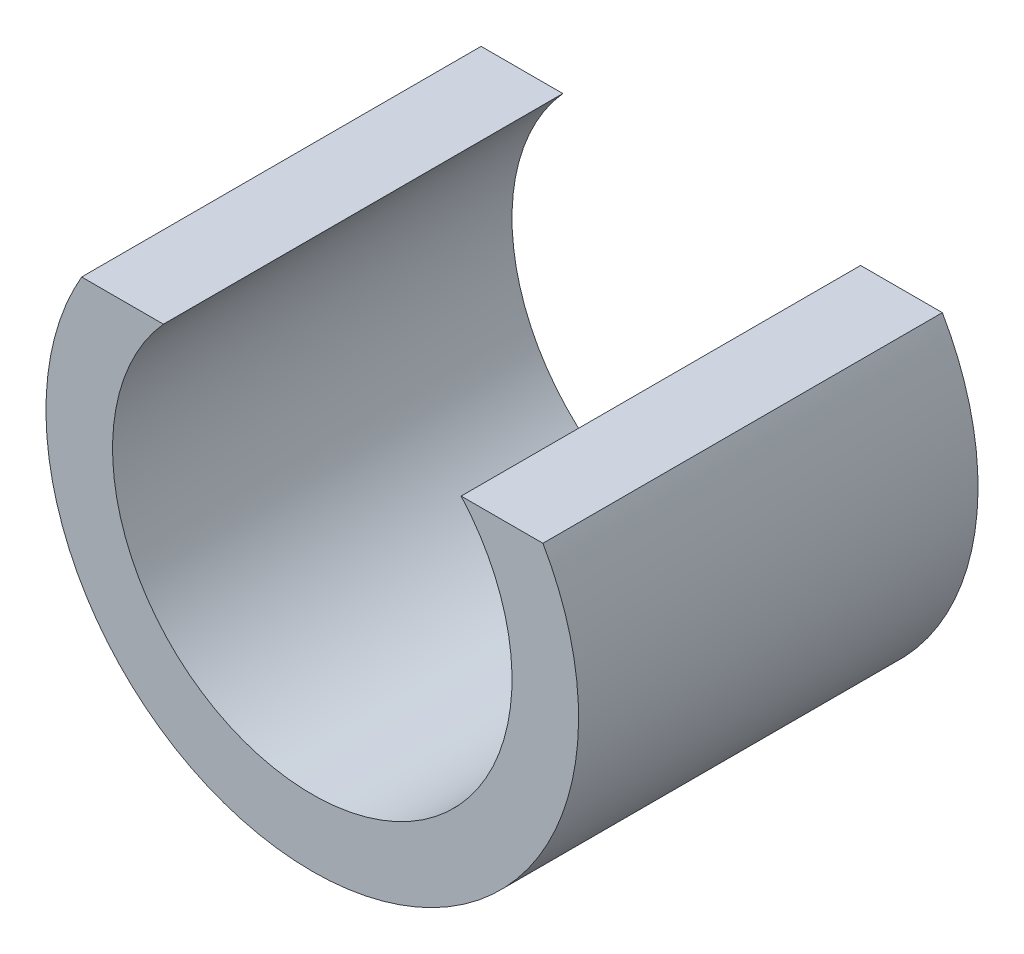
ISO-10303-21;
HEADER;
FILE_DESCRIPTION(('STEP AP214'),'2;1');
FILE_NAME('part.step','',(''),(''),'','','');
FILE_SCHEMA(('AUTOMOTIVE_DESIGN { 1 0 10303 214 1 1 1 1 }'));
ENDSEC;
DATA;
#1=APPLICATION_CONTEXT('core data for automotive mechanical design processes');
#2=APPLICATION_PROTOCOL_DEFINITION('international standard','automotive_design',2000,#1);
#3=PRODUCT_CONTEXT('',#1,'mechanical');
#4=PRODUCT('Part','Part','',(#3));
#5=PRODUCT_RELATED_PRODUCT_CATEGORY('part','',(#4));
#6=PRODUCT_DEFINITION_FORMATION('','',#4);
#7=PRODUCT_DEFINITION_CONTEXT('part definition',#1,'design');
#8=PRODUCT_DEFINITION('design','',#6,#7);
#9=PRODUCT_DEFINITION_SHAPE('','',#8);
#10=(LENGTH_UNIT() NAMED_UNIT(*) SI_UNIT(.MILLI.,.METRE.));
#11=(NAMED_UNIT(*) PLANE_ANGLE_UNIT() SI_UNIT($,.RADIAN.));
#12=(NAMED_UNIT(*) SI_UNIT($,.STERADIAN.) SOLID_ANGLE_UNIT());
#13=UNCERTAINTY_MEASURE_WITH_UNIT(LENGTH_MEASURE(1.E-05),#10,'distance_accuracy_value','');
#14=(GEOMETRIC_REPRESENTATION_CONTEXT(3) GLOBAL_UNCERTAINTY_ASSIGNED_CONTEXT((#13)) GLOBAL_UNIT_ASSIGNED_CONTEXT((#10,
#11,#12)) REPRESENTATION_CONTEXT('',''));
#15=CARTESIAN_POINT('',(0.,0.,0.));
#16=DIRECTION('',(0.,0.,1.));
#17=DIRECTION('',(1.,0.,0.));
#18=AXIS2_PLACEMENT_3D('',#15,#16,#17);
#19=CARTESIAN_POINT('',(0.,0.,3.));
#20=DIRECTION('',(0.,0.,-1.));
#21=DIRECTION('',(-1.,0.,0.));
#22=AXIS2_PLACEMENT_3D('',#19,#20,#21);
#23=CYLINDRICAL_SURFACE('',#22,2.);
#24=CARTESIAN_POINT('',(0.,0.,0.));
#25=DIRECTION('',(0.,0.,1.));
#26=DIRECTION('',(1.,0.,0.));
#27=AXIS2_PLACEMENT_3D('',#24,#25,#26);
#28=CIRCLE('',#27,2.);
#29=CARTESIAN_POINT('',(-1.73205080756888,1.,0.));
#30=VERTEX_POINT('',#29);
#31=CARTESIAN_POINT('',(1.73205080756888,1.,0.));
#32=VERTEX_POINT('',#31);
#33=EDGE_CURVE('E39',#30,#32,#28,.T.);
#34=ORIENTED_EDGE('',*,*,#33,.T.);
#35=DIRECTION('',(0.,0.,-1.));
#36=VECTOR('',#35,1.);
#37=CARTESIAN_POINT('',(1.73205080756888,1.,3.));
#38=LINE('',#37,#36);
#39=CARTESIAN_POINT('',(1.73205080756888,1.,3.));
#40=VERTEX_POINT('',#39);
#41=EDGE_CURVE('E58',#32,#40,#38,.F.);
#42=ORIENTED_EDGE('',*,*,#41,.T.);
#43=CARTESIAN_POINT('',(0.,0.,3.));
#44=DIRECTION('',(0.,0.,1.));
#45=DIRECTION('',(1.,0.,0.));
#46=AXIS2_PLACEMENT_3D('',#43,#44,#45);
#47=CIRCLE('',#46,2.);
#48=CARTESIAN_POINT('',(-1.73205080756888,1.,3.));
#49=VERTEX_POINT('',#48);
#50=EDGE_CURVE('E11',#49,#40,#47,.T.);
#51=ORIENTED_EDGE('',*,*,#50,.F.);
#52=DIRECTION('',(0.,0.,-1.));
#53=VECTOR('',#52,1.);
#54=CARTESIAN_POINT('',(-1.73205080756888,1.,3.));
#55=LINE('',#54,#53);
#56=EDGE_CURVE('E80',#30,#49,#55,.F.);
#57=ORIENTED_EDGE('',*,*,#56,.F.);
#58=EDGE_LOOP('',(#34,#42,#51,#57));
#59=FACE_BOUND('',#58,.T.);
#60=ADVANCED_FACE('F36',(#59),#23,.T.);
#61=CARTESIAN_POINT('',(0.,0.,3.));
#62=DIRECTION('',(0.,0.,1.));
#63=DIRECTION('',(1.,0.,0.));
#64=AXIS2_PLACEMENT_3D('',#61,#62,#63);
#65=PLANE('',#64);
#66=DIRECTION('',(1.,0.,0.));
#67=VECTOR('',#66,1.);
#68=CARTESIAN_POINT('',(0.,1.,3.));
#69=LINE('',#68,#67);
#70=CARTESIAN_POINT('',(1.1180339887499,1.,3.));
#71=VERTEX_POINT('',#70);
#72=EDGE_CURVE('E93',#71,#40,#69,.T.);
#73=ORIENTED_EDGE('',*,*,#72,.F.);
#74=CARTESIAN_POINT('',(0.,0.,3.));
#75=DIRECTION('',(0.,0.,1.));
#76=DIRECTION('',(1.,0.,0.));
#77=AXIS2_PLACEMENT_3D('',#74,#75,#76);
#78=CIRCLE('',#77,1.5);
#79=CARTESIAN_POINT('',(-1.1180339887499,1.,3.));
#80=VERTEX_POINT('',#79);
#81=EDGE_CURVE('E78',#80,#71,#78,.T.);
#82=ORIENTED_EDGE('',*,*,#81,.F.);
#83=DIRECTION('',(-1.,0.,0.));
#84=VECTOR('',#83,1.);
#85=CARTESIAN_POINT('',(0.,1.,3.));
#86=LINE('',#85,#84);
#87=EDGE_CURVE('E96',#80,#49,#86,.T.);
#88=ORIENTED_EDGE('',*,*,#87,.T.);
#89=ORIENTED_EDGE('',*,*,#50,.T.);
#90=EDGE_LOOP('',(#73,#82,#88,#89));
#91=FACE_BOUND('',#90,.T.);
#92=ADVANCED_FACE('F110',(#91),#65,.T.);
#93=CARTESIAN_POINT('',(0.,0.,0.));
#94=DIRECTION('',(0.,0.,1.));
#95=DIRECTION('',(1.,0.,0.));
#96=AXIS2_PLACEMENT_3D('',#93,#94,#95);
#97=PLANE('',#96);
#98=CARTESIAN_POINT('',(0.,0.,0.));
#99=DIRECTION('',(0.,0.,1.));
#100=DIRECTION('',(1.,0.,0.));
#101=AXIS2_PLACEMENT_3D('',#98,#99,#100);
#102=CIRCLE('',#101,1.5);
#103=CARTESIAN_POINT('',(-1.1180339887499,1.,0.));
#104=VERTEX_POINT('',#103);
#105=CARTESIAN_POINT('',(1.1180339887499,1.,0.));
#106=VERTEX_POINT('',#105);
#107=EDGE_CURVE('E50',#104,#106,#102,.T.);
#108=ORIENTED_EDGE('',*,*,#107,.T.);
#109=DIRECTION('',(1.,0.,0.));
#110=VECTOR('',#109,1.);
#111=CARTESIAN_POINT('',(0.,1.,0.));
#112=LINE('',#111,#110);
#113=EDGE_CURVE('E83',#106,#32,#112,.T.);
#114=ORIENTED_EDGE('',*,*,#113,.T.);
#115=ORIENTED_EDGE('',*,*,#33,.F.);
#116=DIRECTION('',(-1.,0.,0.));
#117=VECTOR('',#116,1.);
#118=CARTESIAN_POINT('',(0.,1.,0.));
#119=LINE('',#118,#117);
#120=EDGE_CURVE('E91',#104,#30,#119,.T.);
#121=ORIENTED_EDGE('',*,*,#120,.F.);
#122=EDGE_LOOP('',(#108,#114,#115,#121));
#123=FACE_BOUND('',#122,.T.);
#124=ADVANCED_FACE('F90',(#123),#97,.F.);
#125=CARTESIAN_POINT('',(0.,1.,0.));
#126=DIRECTION('',(0.,-1.,0.));
#127=DIRECTION('',(0.,0.,-1.));
#128=AXIS2_PLACEMENT_3D('',#125,#126,#127);
#129=PLANE('',#128);
#130=ORIENTED_EDGE('',*,*,#113,.F.);
#131=DIRECTION('',(0.,0.,1.));
#132=VECTOR('',#131,1.);
#133=CARTESIAN_POINT('',(1.1180339887499,1.,0.));
#134=LINE('',#133,#132);
#135=EDGE_CURVE('E75',#106,#71,#134,.T.);
#136=ORIENTED_EDGE('',*,*,#135,.T.);
#137=ORIENTED_EDGE('',*,*,#72,.T.);
#138=ORIENTED_EDGE('',*,*,#41,.F.);
#139=EDGE_LOOP('',(#130,#136,#137,#138));
#140=FACE_BOUND('',#139,.T.);
#141=ADVANCED_FACE('F84',(#140),#129,.F.);
#142=CARTESIAN_POINT('',(0.,1.,0.));
#143=DIRECTION('',(0.,1.,0.));
#144=DIRECTION('',(-1.,0.,0.));
#145=AXIS2_PLACEMENT_3D('',#142,#143,#144);
#146=PLANE('',#145);
#147=ORIENTED_EDGE('',*,*,#56,.T.);
#148=ORIENTED_EDGE('',*,*,#87,.F.);
#149=DIRECTION('',(0.,0.,1.));
#150=VECTOR('',#149,1.);
#151=CARTESIAN_POINT('',(-1.1180339887499,1.,0.));
#152=LINE('',#151,#150);
#153=EDGE_CURVE('E81',#104,#80,#152,.T.);
#154=ORIENTED_EDGE('',*,*,#153,.F.);
#155=ORIENTED_EDGE('',*,*,#120,.T.);
#156=EDGE_LOOP('',(#147,#148,#154,#155));
#157=FACE_BOUND('',#156,.T.);
#158=ADVANCED_FACE('F108',(#157),#146,.T.);
#159=CARTESIAN_POINT('',(0.,0.,0.));
#160=DIRECTION('',(0.,0.,1.));
#161=DIRECTION('',(1.,0.,0.));
#162=AXIS2_PLACEMENT_3D('',#159,#160,#161);
#163=CYLINDRICAL_SURFACE('',#162,1.5);
#164=ORIENTED_EDGE('',*,*,#81,.T.);
#165=ORIENTED_EDGE('',*,*,#135,.F.);
#166=ORIENTED_EDGE('',*,*,#107,.F.);
#167=ORIENTED_EDGE('',*,*,#153,.T.);
#168=EDGE_LOOP('',(#164,#165,#166,#167));
#169=FACE_BOUND('',#168,.T.);
#170=ADVANCED_FACE('F76',(#169),#163,.F.);
#171=CLOSED_SHELL('',(#60,#92,#124,#141,#158,#170));
#172=MANIFOLD_SOLID_BREP('B2',#171);
#173=ADVANCED_BREP_SHAPE_REPRESENTATION('',(#18,#172),#14);
#174=SHAPE_DEFINITION_REPRESENTATION(#9,#173);
ENDSEC;
END-ISO-10303-21;
